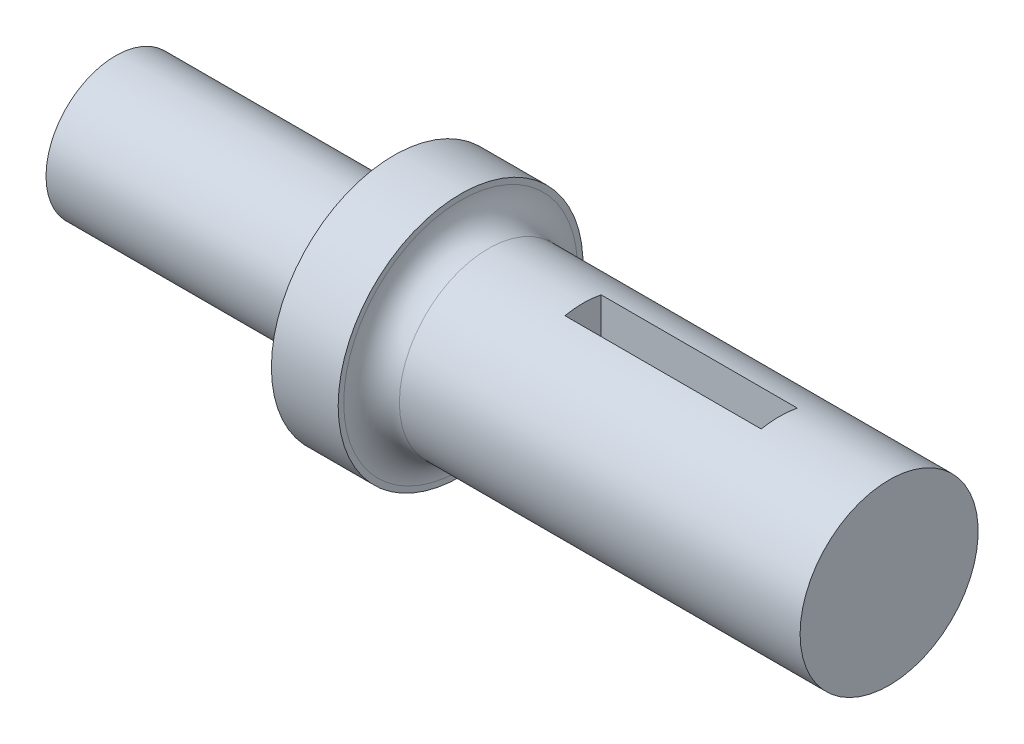
ISO-10303-21;
HEADER;
FILE_DESCRIPTION(('STEP AP214'),'2;1');
FILE_NAME('part.step','',(''),(''),'','','');
FILE_SCHEMA(('AUTOMOTIVE_DESIGN { 1 0 10303 214 1 1 1 1 }'));
ENDSEC;
DATA;
#1=APPLICATION_CONTEXT('core data for automotive mechanical design processes');
#2=APPLICATION_PROTOCOL_DEFINITION('international standard','automotive_design',2000,#1);
#3=PRODUCT_CONTEXT('',#1,'mechanical');
#4=PRODUCT('Part','Part','',(#3));
#5=PRODUCT_RELATED_PRODUCT_CATEGORY('part','',(#4));
#6=PRODUCT_DEFINITION_FORMATION('','',#4);
#7=PRODUCT_DEFINITION_CONTEXT('part definition',#1,'design');
#8=PRODUCT_DEFINITION('design','',#6,#7);
#9=PRODUCT_DEFINITION_SHAPE('','',#8);
#10=(LENGTH_UNIT() NAMED_UNIT(*) SI_UNIT(.MILLI.,.METRE.));
#11=(NAMED_UNIT(*) PLANE_ANGLE_UNIT() SI_UNIT($,.RADIAN.));
#12=(NAMED_UNIT(*) SI_UNIT($,.STERADIAN.) SOLID_ANGLE_UNIT());
#13=UNCERTAINTY_MEASURE_WITH_UNIT(LENGTH_MEASURE(1.E-05),#10,'distance_accuracy_value','');
#14=(GEOMETRIC_REPRESENTATION_CONTEXT(3) GLOBAL_UNCERTAINTY_ASSIGNED_CONTEXT((#13)) GLOBAL_UNIT_ASSIGNED_CONTEXT((#10,
#11,#12)) REPRESENTATION_CONTEXT('',''));
#15=CARTESIAN_POINT('',(0.,0.,0.));
#16=DIRECTION('',(0.,0.,1.));
#17=DIRECTION('',(1.,0.,0.));
#18=AXIS2_PLACEMENT_3D('',#15,#16,#17);
#19=CARTESIAN_POINT('',(-139.,0.,0.));
#20=DIRECTION('',(-1.,0.,0.));
#21=DIRECTION('',(0.,0.,1.));
#22=AXIS2_PLACEMENT_3D('',#19,#20,#21);
#23=CYLINDRICAL_SURFACE('',#22,16.);
#24=DIRECTION('',(-1.,0.,0.));
#25=VECTOR('',#24,1.);
#26=CARTESIAN_POINT('',(-139.,-15.6664450338933,-3.25));
#27=LINE('',#26,#25);
#28=CARTESIAN_POINT('',(-55.,-15.6664450338933,-3.25));
#29=VERTEX_POINT('',#28);
#30=CARTESIAN_POINT('',(-22.2533156027115,-15.6664450338933,-3.25));
#31=VERTEX_POINT('',#30);
#32=EDGE_CURVE('E98',#29,#31,#27,.F.);
#33=ORIENTED_EDGE('',*,*,#32,.F.);
#34=CARTESIAN_POINT('',(-55.,0.,0.));
#35=DIRECTION('',(-1.,0.,0.));
#36=DIRECTION('',(0.,0.,1.));
#37=AXIS2_PLACEMENT_3D('',#34,#35,#36);
#38=CIRCLE('',#37,16.);
#39=CARTESIAN_POINT('',(-55.,-15.6664450338933,3.25));
#40=VERTEX_POINT('',#39);
#41=EDGE_CURVE('E84',#29,#40,#38,.T.);
#42=ORIENTED_EDGE('',*,*,#41,.T.);
#43=DIRECTION('',(-1.,0.,0.));
#44=VECTOR('',#43,1.);
#45=CARTESIAN_POINT('',(-139.,-15.6664450338933,3.25));
#46=LINE('',#45,#44);
#47=CARTESIAN_POINT('',(-22.2533156027115,-15.6664450338933,3.25));
#48=VERTEX_POINT('',#47);
#49=EDGE_CURVE('E79',#40,#48,#46,.F.);
#50=ORIENTED_EDGE('',*,*,#49,.T.);
#51=CARTESIAN_POINT('',(-21.,0.,0.));
#52=DIRECTION('',(0.996815278536125,-0.07974522228289,0.));
#53=DIRECTION('',(-0.07974522228289,-0.996815278536125,0.));
#54=AXIS2_PLACEMENT_3D('',#51,#52,#53);
#55=ELLIPSE('',#54,16.0511183411001,16.);
#56=EDGE_CURVE('E99',#48,#31,#55,.T.);
#57=ORIENTED_EDGE('',*,*,#56,.T.);
#58=EDGE_LOOP('',(#33,#42,#50,#57));
#59=FACE_BOUND('',#58,.T.);
#60=CARTESIAN_POINT('',(-72.,0.,0.));
#61=DIRECTION('',(-1.,0.,0.));
#62=DIRECTION('',(0.,0.,1.));
#63=AXIS2_PLACEMENT_3D('',#60,#61,#62);
#64=CIRCLE('',#63,16.);
#65=CARTESIAN_POINT('',(-72.,0.,16.));
#66=VERTEX_POINT('',#65);
#67=EDGE_CURVE('E133',#66,#66,#64,.T.);
#68=ORIENTED_EDGE('',*,*,#67,.F.);
#69=EDGE_LOOP('',(#68));
#70=FACE_BOUND('',#69,.T.);
#71=CARTESIAN_POINT('',(0.,0.,0.));
#72=DIRECTION('',(-1.,0.,0.));
#73=DIRECTION('',(0.,0.,1.));
#74=AXIS2_PLACEMENT_3D('',#71,#72,#73);
#75=CIRCLE('',#74,16.);
#76=CARTESIAN_POINT('',(0.,0.,16.));
#77=VERTEX_POINT('',#76);
#78=EDGE_CURVE('E85',#77,#77,#75,.T.);
#79=ORIENTED_EDGE('',*,*,#78,.T.);
#80=EDGE_LOOP('',(#79));
#81=FACE_BOUND('',#80,.T.);
#82=DIRECTION('',(-1.,0.,0.));
#83=VECTOR('',#82,1.);
#84=CARTESIAN_POINT('',(-139.,15.6664450338933,-3.25));
#85=LINE('',#84,#83);
#86=CARTESIAN_POINT('',(-19.7466843972885,15.6664450338933,-3.25));
#87=VERTEX_POINT('',#86);
#88=CARTESIAN_POINT('',(-55.,15.6664450338933,-3.25));
#89=VERTEX_POINT('',#88);
#90=EDGE_CURVE('E11',#87,#89,#85,.T.);
#91=ORIENTED_EDGE('',*,*,#90,.F.);
#92=CARTESIAN_POINT('',(-19.7466843972885,15.6664450338933,3.25));
#93=VERTEX_POINT('',#92);
#94=EDGE_CURVE('E50',#87,#93,#55,.T.);
#95=ORIENTED_EDGE('',*,*,#94,.T.);
#96=DIRECTION('',(-1.,0.,0.));
#97=VECTOR('',#96,1.);
#98=CARTESIAN_POINT('',(-139.,15.6664450338933,3.25));
#99=LINE('',#98,#97);
#100=CARTESIAN_POINT('',(-55.,15.6664450338933,3.25));
#101=VERTEX_POINT('',#100);
#102=EDGE_CURVE('E102',#93,#101,#99,.T.);
#103=ORIENTED_EDGE('',*,*,#102,.T.);
#104=EDGE_CURVE('E92',#101,#89,#38,.T.);
#105=ORIENTED_EDGE('',*,*,#104,.T.);
#106=EDGE_LOOP('',(#91,#95,#103,#105));
#107=FACE_BOUND('',#106,.T.);
#108=ADVANCED_FACE('F42',(#59,#70,#81,#107),#23,.T.);
#109=CARTESIAN_POINT('',(-139.,0.,-12.5));
#110=DIRECTION('',(1.,0.,0.));
#111=DIRECTION('',(0.,0.,-1.));
#112=AXIS2_PLACEMENT_3D('',#109,#110,#111);
#113=PLANE('',#112);
#114=CARTESIAN_POINT('',(-139.,0.,0.));
#115=DIRECTION('',(-1.,0.,0.));
#116=DIRECTION('',(0.,0.,1.));
#117=AXIS2_PLACEMENT_3D('',#114,#115,#116);
#118=CIRCLE('',#117,12.5);
#119=CARTESIAN_POINT('',(-139.,0.,12.5));
#120=VERTEX_POINT('',#119);
#121=EDGE_CURVE('E114',#120,#120,#118,.T.);
#122=ORIENTED_EDGE('',*,*,#121,.T.);
#123=EDGE_LOOP('',(#122));
#124=FACE_BOUND('',#123,.T.);
#125=ADVANCED_FACE('F44',(#124),#113,.F.);
#126=CARTESIAN_POINT('',(0.,0.,0.));
#127=DIRECTION('',(-1.,0.,0.));
#128=DIRECTION('',(0.,0.,1.));
#129=AXIS2_PLACEMENT_3D('',#126,#127,#128);
#130=PLANE('',#129);
#131=ORIENTED_EDGE('',*,*,#78,.F.);
#132=EDGE_LOOP('',(#131));
#133=FACE_BOUND('',#132,.T.);
#134=ADVANCED_FACE('F140',(#133),#130,.F.);
#135=CARTESIAN_POINT('',(-72.,0.,0.));
#136=DIRECTION('',(-1.,0.,0.));
#137=DIRECTION('',(0.,0.,1.));
#138=AXIS2_PLACEMENT_3D('',#135,#136,#137);
#139=TOROIDAL_SURFACE('',#138,21.,5.);
#140=CARTESIAN_POINT('',(-77.,0.,0.));
#141=DIRECTION('',(-1.,0.,0.));
#142=DIRECTION('',(0.,0.,1.));
#143=AXIS2_PLACEMENT_3D('',#140,#141,#142);
#144=CIRCLE('',#143,21.);
#145=CARTESIAN_POINT('',(-77.,0.,21.));
#146=VERTEX_POINT('',#145);
#147=EDGE_CURVE('E130',#146,#146,#144,.T.);
#148=ORIENTED_EDGE('',*,*,#147,.F.);
#149=EDGE_LOOP('',(#148));
#150=FACE_BOUND('',#149,.T.);
#151=ORIENTED_EDGE('',*,*,#67,.T.);
#152=EDGE_LOOP('',(#151));
#153=FACE_BOUND('',#152,.T.);
#154=ADVANCED_FACE('F142',(#150,#153),#139,.F.);
#155=CARTESIAN_POINT('',(-77.,0.,-21.));
#156=DIRECTION('',(-1.,0.,0.));
#157=DIRECTION('',(0.,0.,1.));
#158=AXIS2_PLACEMENT_3D('',#155,#156,#157);
#159=PLANE('',#158);
#160=CARTESIAN_POINT('',(-77.,0.,0.));
#161=DIRECTION('',(-1.,0.,0.));
#162=DIRECTION('',(0.,0.,1.));
#163=AXIS2_PLACEMENT_3D('',#160,#161,#162);
#164=CIRCLE('',#163,22.);
#165=CARTESIAN_POINT('',(-77.,0.,22.));
#166=VERTEX_POINT('',#165);
#167=EDGE_CURVE('E127',#166,#166,#164,.T.);
#168=ORIENTED_EDGE('',*,*,#167,.F.);
#169=EDGE_LOOP('',(#168));
#170=FACE_BOUND('',#169,.T.);
#171=ORIENTED_EDGE('',*,*,#147,.T.);
#172=EDGE_LOOP('',(#171));
#173=FACE_BOUND('',#172,.T.);
#174=ADVANCED_FACE('F147',(#170,#173),#159,.F.);
#175=CARTESIAN_POINT('',(-139.,0.,0.));
#176=DIRECTION('',(-1.,0.,0.));
#177=DIRECTION('',(0.,0.,1.));
#178=AXIS2_PLACEMENT_3D('',#175,#176,#177);
#179=CYLINDRICAL_SURFACE('',#178,22.);
#180=CARTESIAN_POINT('',(-89.,0.,0.));
#181=DIRECTION('',(-1.,0.,0.));
#182=DIRECTION('',(0.,0.,1.));
#183=AXIS2_PLACEMENT_3D('',#180,#181,#182);
#184=CIRCLE('',#183,22.);
#185=CARTESIAN_POINT('',(-89.,0.,22.));
#186=VERTEX_POINT('',#185);
#187=EDGE_CURVE('E124',#186,#186,#184,.T.);
#188=ORIENTED_EDGE('',*,*,#187,.F.);
#189=EDGE_LOOP('',(#188));
#190=FACE_BOUND('',#189,.T.);
#191=ORIENTED_EDGE('',*,*,#167,.T.);
#192=EDGE_LOOP('',(#191));
#193=FACE_BOUND('',#192,.T.);
#194=ADVANCED_FACE('F158',(#190,#193),#179,.T.);
#195=CARTESIAN_POINT('',(-89.,0.,-22.));
#196=DIRECTION('',(1.,0.,0.));
#197=DIRECTION('',(0.,0.,-1.));
#198=AXIS2_PLACEMENT_3D('',#195,#196,#197);
#199=PLANE('',#198);
#200=CARTESIAN_POINT('',(-89.,0.,0.));
#201=DIRECTION('',(-1.,0.,0.));
#202=DIRECTION('',(0.,0.,1.));
#203=AXIS2_PLACEMENT_3D('',#200,#201,#202);
#204=CIRCLE('',#203,12.5);
#205=CARTESIAN_POINT('',(-89.,0.,12.5));
#206=VERTEX_POINT('',#205);
#207=EDGE_CURVE('E117',#206,#206,#204,.T.);
#208=ORIENTED_EDGE('',*,*,#207,.F.);
#209=EDGE_LOOP('',(#208));
#210=FACE_BOUND('',#209,.T.);
#211=ORIENTED_EDGE('',*,*,#187,.T.);
#212=EDGE_LOOP('',(#211));
#213=FACE_BOUND('',#212,.T.);
#214=ADVANCED_FACE('F162',(#210,#213),#199,.F.);
#215=CARTESIAN_POINT('',(-139.,0.,0.));
#216=DIRECTION('',(-1.,0.,0.));
#217=DIRECTION('',(0.,0.,1.));
#218=AXIS2_PLACEMENT_3D('',#215,#216,#217);
#219=CYLINDRICAL_SURFACE('',#218,12.5);
#220=ORIENTED_EDGE('',*,*,#121,.F.);
#221=EDGE_LOOP('',(#220));
#222=FACE_BOUND('',#221,.T.);
#223=ORIENTED_EDGE('',*,*,#207,.T.);
#224=EDGE_LOOP('',(#223));
#225=FACE_BOUND('',#224,.T.);
#226=ADVANCED_FACE('F166',(#222,#225),#219,.T.);
#227=CARTESIAN_POINT('',(-25.,-50.,-3.25));
#228=DIRECTION('',(0.996815278536125,-0.07974522228289,0.));
#229=DIRECTION('',(0.07974522228289,0.996815278536125,0.));
#230=AXIS2_PLACEMENT_3D('',#227,#228,#229);
#231=PLANE('',#230);
#232=DIRECTION('',(0.07974522228289,0.996815278536125,0.));
#233=VECTOR('',#232,1.);
#234=CARTESIAN_POINT('',(-25.,-50.,-3.25));
#235=LINE('',#234,#233);
#236=EDGE_CURVE('E111',#31,#87,#235,.T.);
#237=ORIENTED_EDGE('',*,*,#236,.F.);
#238=ORIENTED_EDGE('',*,*,#56,.F.);
#239=DIRECTION('',(0.07974522228289,0.996815278536125,0.));
#240=VECTOR('',#239,1.);
#241=CARTESIAN_POINT('',(-25.,-50.,3.25));
#242=LINE('',#241,#240);
#243=EDGE_CURVE('E62',#48,#93,#242,.T.);
#244=ORIENTED_EDGE('',*,*,#243,.T.);
#245=ORIENTED_EDGE('',*,*,#94,.F.);
#246=EDGE_LOOP('',(#237,#238,#244,#245));
#247=FACE_BOUND('',#246,.T.);
#248=ADVANCED_FACE('F113',(#247),#231,.F.);
#249=CARTESIAN_POINT('',(-55.,0.,-3.25));
#250=DIRECTION('',(-1.,0.,0.));
#251=DIRECTION('',(0.,0.,1.));
#252=AXIS2_PLACEMENT_3D('',#249,#250,#251);
#253=PLANE('',#252);
#254=DIRECTION('',(0.,-1.,0.));
#255=VECTOR('',#254,1.);
#256=CARTESIAN_POINT('',(-55.,0.,3.25));
#257=LINE('',#256,#255);
#258=EDGE_CURVE('E57',#101,#40,#257,.T.);
#259=ORIENTED_EDGE('',*,*,#258,.T.);
#260=ORIENTED_EDGE('',*,*,#41,.F.);
#261=DIRECTION('',(0.,1.,0.));
#262=VECTOR('',#261,1.);
#263=CARTESIAN_POINT('',(-55.,0.,-3.25));
#264=LINE('',#263,#262);
#265=EDGE_CURVE('E94',#29,#89,#264,.T.);
#266=ORIENTED_EDGE('',*,*,#265,.T.);
#267=ORIENTED_EDGE('',*,*,#104,.F.);
#268=EDGE_LOOP('',(#259,#260,#266,#267));
#269=FACE_BOUND('',#268,.T.);
#270=ADVANCED_FACE('F88',(#269),#253,.F.);
#271=CARTESIAN_POINT('',(0.,0.,-3.25));
#272=DIRECTION('',(0.,0.,1.));
#273=DIRECTION('',(1.,0.,0.));
#274=AXIS2_PLACEMENT_3D('',#271,#272,#273);
#275=PLANE('',#274);
#276=ORIENTED_EDGE('',*,*,#90,.T.);
#277=ORIENTED_EDGE('',*,*,#265,.F.);
#278=ORIENTED_EDGE('',*,*,#32,.T.);
#279=ORIENTED_EDGE('',*,*,#236,.T.);
#280=EDGE_LOOP('',(#276,#277,#278,#279));
#281=FACE_BOUND('',#280,.T.);
#282=ADVANCED_FACE('F110',(#281),#275,.T.);
#283=CARTESIAN_POINT('',(0.,0.,3.25));
#284=DIRECTION('',(0.,0.,1.));
#285=DIRECTION('',(1.,0.,0.));
#286=AXIS2_PLACEMENT_3D('',#283,#284,#285);
#287=PLANE('',#286);
#288=ORIENTED_EDGE('',*,*,#243,.F.);
#289=ORIENTED_EDGE('',*,*,#49,.F.);
#290=ORIENTED_EDGE('',*,*,#258,.F.);
#291=ORIENTED_EDGE('',*,*,#102,.F.);
#292=EDGE_LOOP('',(#288,#289,#290,#291));
#293=FACE_BOUND('',#292,.T.);
#294=ADVANCED_FACE('F80',(#293),#287,.F.);
#295=CLOSED_SHELL('',(#108,#125,#134,#154,#174,#194,#214,#226,#248,#270,#282,#294));
#296=MANIFOLD_SOLID_BREP('B2',#295);
#297=ADVANCED_BREP_SHAPE_REPRESENTATION('',(#18,#296),#14);
#298=SHAPE_DEFINITION_REPRESENTATION(#9,#297);
ENDSEC;
END-ISO-10303-21;
